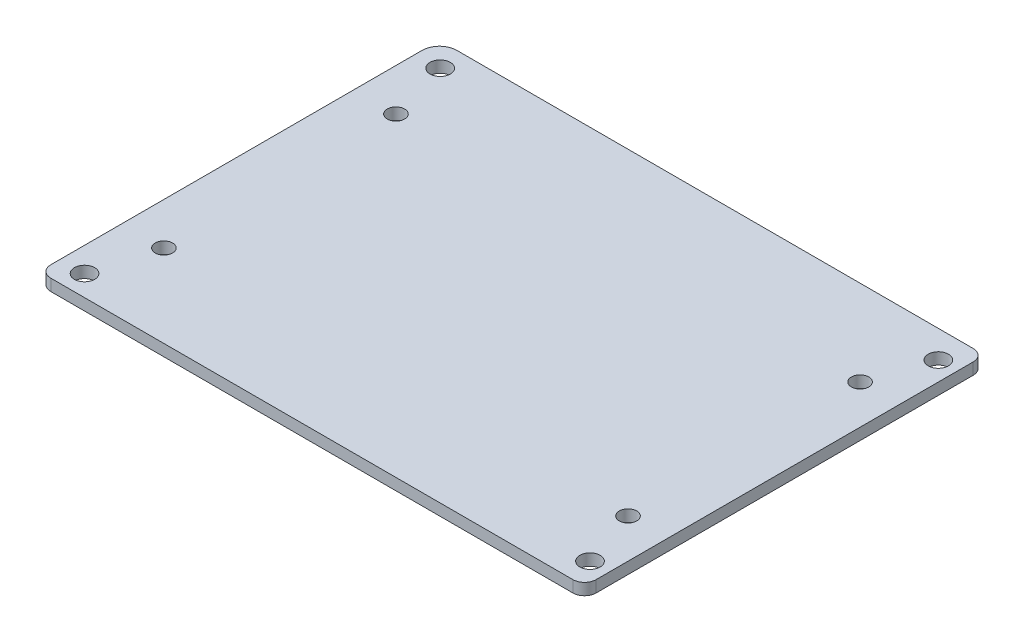
ISO-10303-21;
HEADER;
FILE_DESCRIPTION(('STEP AP214'),'2;1');
FILE_NAME('part.step','',(''),(''),'','','');
FILE_SCHEMA(('AUTOMOTIVE_DESIGN { 1 0 10303 214 1 1 1 1 }'));
ENDSEC;
DATA;
#1=APPLICATION_CONTEXT('core data for automotive mechanical design processes');
#2=APPLICATION_PROTOCOL_DEFINITION('international standard','automotive_design',2000,#1);
#3=PRODUCT_CONTEXT('',#1,'mechanical');
#4=PRODUCT('Part','Part','',(#3));
#5=PRODUCT_RELATED_PRODUCT_CATEGORY('part','',(#4));
#6=PRODUCT_DEFINITION_FORMATION('','',#4);
#7=PRODUCT_DEFINITION_CONTEXT('part definition',#1,'design');
#8=PRODUCT_DEFINITION('design','',#6,#7);
#9=PRODUCT_DEFINITION_SHAPE('','',#8);
#10=(LENGTH_UNIT() NAMED_UNIT(*) SI_UNIT(.MILLI.,.METRE.));
#11=(NAMED_UNIT(*) PLANE_ANGLE_UNIT() SI_UNIT($,.RADIAN.));
#12=(NAMED_UNIT(*) SI_UNIT($,.STERADIAN.) SOLID_ANGLE_UNIT());
#13=UNCERTAINTY_MEASURE_WITH_UNIT(LENGTH_MEASURE(1.E-05),#10,'distance_accuracy_value','');
#14=(GEOMETRIC_REPRESENTATION_CONTEXT(3) GLOBAL_UNCERTAINTY_ASSIGNED_CONTEXT((#13)) GLOBAL_UNIT_ASSIGNED_CONTEXT((#10,
#11,#12)) REPRESENTATION_CONTEXT('',''));
#15=CARTESIAN_POINT('',(0.,0.,0.));
#16=DIRECTION('',(0.,0.,1.));
#17=DIRECTION('',(1.,0.,0.));
#18=AXIS2_PLACEMENT_3D('',#15,#16,#17);
#19=CARTESIAN_POINT('',(44.7518020275219,2.,-32.7486797980187));
#20=DIRECTION('',(0.,-1.,0.));
#21=DIRECTION('',(0.,0.,-1.));
#22=AXIS2_PLACEMENT_3D('',#19,#20,#21);
#23=PLANE('',#22);
#24=CARTESIAN_POINT('',(40.0000000000001,2.,20.));
#25=DIRECTION('',(0.,1.,0.));
#26=DIRECTION('',(0.,0.,1.));
#27=AXIS2_PLACEMENT_3D('',#24,#25,#26);
#28=CIRCLE('',#27,1.5);
#29=CARTESIAN_POINT('',(40.0000000000001,2.,21.5));
#30=VERTEX_POINT('',#29);
#31=EDGE_CURVE('E170',#30,#30,#28,.T.);
#32=ORIENTED_EDGE('',*,*,#31,.F.);
#33=EDGE_LOOP('',(#32));
#34=FACE_BOUND('',#33,.T.);
#35=CARTESIAN_POINT('',(40.,2.,-20.));
#36=DIRECTION('',(0.,1.,0.));
#37=DIRECTION('',(0.,0.,1.));
#38=AXIS2_PLACEMENT_3D('',#35,#36,#37);
#39=CIRCLE('',#38,1.5);
#40=CARTESIAN_POINT('',(40.,2.,-18.5));
#41=VERTEX_POINT('',#40);
#42=EDGE_CURVE('E281',#41,#41,#39,.T.);
#43=ORIENTED_EDGE('',*,*,#42,.F.);
#44=EDGE_LOOP('',(#43));
#45=FACE_BOUND('',#44,.T.);
#46=CARTESIAN_POINT('',(-40.0000000000001,2.,-20.));
#47=DIRECTION('',(0.,1.,0.));
#48=DIRECTION('',(0.,0.,1.));
#49=AXIS2_PLACEMENT_3D('',#46,#47,#48);
#50=CIRCLE('',#49,1.5);
#51=CARTESIAN_POINT('',(-40.0000000000001,2.,-18.5));
#52=VERTEX_POINT('',#51);
#53=EDGE_CURVE('E183',#52,#52,#50,.T.);
#54=ORIENTED_EDGE('',*,*,#53,.F.);
#55=EDGE_LOOP('',(#54));
#56=FACE_BOUND('',#55,.T.);
#57=CARTESIAN_POINT('',(-40.,2.,20.));
#58=DIRECTION('',(0.,1.,0.));
#59=DIRECTION('',(0.,0.,1.));
#60=AXIS2_PLACEMENT_3D('',#57,#58,#59);
#61=CIRCLE('',#60,1.5);
#62=CARTESIAN_POINT('',(-40.,2.,21.5));
#63=VERTEX_POINT('',#62);
#64=EDGE_CURVE('E166',#63,#63,#61,.T.);
#65=ORIENTED_EDGE('',*,*,#64,.F.);
#66=EDGE_LOOP('',(#65));
#67=FACE_BOUND('',#66,.T.);
#68=CARTESIAN_POINT('',(44.7518020275219,2.,-32.7486797980187));
#69=DIRECTION('',(0.,1.,0.));
#70=DIRECTION('',(0.,0.,-1.));
#71=AXIS2_PLACEMENT_3D('',#68,#69,#70);
#72=CIRCLE('',#71,2.);
#73=CARTESIAN_POINT('',(46.7518020275218,2.,-32.7486797980187));
#74=VERTEX_POINT('',#73);
#75=CARTESIAN_POINT('',(44.7518020275219,2.,-34.7486797980188));
#76=VERTEX_POINT('',#75);
#77=EDGE_CURVE('E150',#74,#76,#72,.T.);
#78=ORIENTED_EDGE('',*,*,#77,.T.);
#79=DIRECTION('',(-1.,0.,0.));
#80=VECTOR('',#79,1.);
#81=CARTESIAN_POINT('',(-44.2481979724781,2.,-34.7486797980187));
#82=LINE('',#81,#80);
#83=CARTESIAN_POINT('',(-44.2481979724781,2.,-34.7486797980187));
#84=VERTEX_POINT('',#83);
#85=EDGE_CURVE('E98',#76,#84,#82,.T.);
#86=ORIENTED_EDGE('',*,*,#85,.T.);
#87=CARTESIAN_POINT('',(-44.2481979724781,2.,-31.7486797980187));
#88=DIRECTION('',(0.,1.,0.));
#89=DIRECTION('',(0.,0.,1.));
#90=AXIS2_PLACEMENT_3D('',#87,#88,#89);
#91=CIRCLE('',#90,3.00000000000001);
#92=CARTESIAN_POINT('',(-47.2481979724782,2.,-31.7486797980187));
#93=VERTEX_POINT('',#92);
#94=EDGE_CURVE('E209',#84,#93,#91,.T.);
#95=ORIENTED_EDGE('',*,*,#94,.T.);
#96=DIRECTION('',(0.,0.,1.));
#97=VECTOR('',#96,1.);
#98=CARTESIAN_POINT('',(-47.2481979724782,2.,-31.7486797980187));
#99=LINE('',#98,#97);
#100=CARTESIAN_POINT('',(-47.2481979724781,2.,32.2513202019813));
#101=VERTEX_POINT('',#100);
#102=EDGE_CURVE('E211',#93,#101,#99,.T.);
#103=ORIENTED_EDGE('',*,*,#102,.T.);
#104=CARTESIAN_POINT('',(-45.2481979724781,2.,32.2513202019813));
#105=DIRECTION('',(0.,1.,0.));
#106=DIRECTION('',(0.,0.,1.));
#107=AXIS2_PLACEMENT_3D('',#104,#105,#106);
#108=CIRCLE('',#107,2.);
#109=CARTESIAN_POINT('',(-45.2481979724781,2.,34.2513202019813));
#110=VERTEX_POINT('',#109);
#111=EDGE_CURVE('E117',#101,#110,#108,.T.);
#112=ORIENTED_EDGE('',*,*,#111,.T.);
#113=DIRECTION('',(1.,0.,0.));
#114=VECTOR('',#113,1.);
#115=CARTESIAN_POINT('',(-45.2481979724781,2.,34.2513202019813));
#116=LINE('',#115,#114);
#117=CARTESIAN_POINT('',(44.7518020275219,2.,34.2513202019813));
#118=VERTEX_POINT('',#117);
#119=EDGE_CURVE('E111',#110,#118,#116,.T.);
#120=ORIENTED_EDGE('',*,*,#119,.T.);
#121=CARTESIAN_POINT('',(44.7518020275219,2.,32.2513202019813));
#122=DIRECTION('',(0.,1.,0.));
#123=DIRECTION('',(0.,0.,1.));
#124=AXIS2_PLACEMENT_3D('',#121,#122,#123);
#125=CIRCLE('',#124,2.);
#126=CARTESIAN_POINT('',(46.7518020275219,2.,32.2513202019813));
#127=VERTEX_POINT('',#126);
#128=EDGE_CURVE('E115',#118,#127,#125,.T.);
#129=ORIENTED_EDGE('',*,*,#128,.T.);
#130=DIRECTION('',(0.,0.,-1.));
#131=VECTOR('',#130,1.);
#132=CARTESIAN_POINT('',(46.7518020275218,2.,-32.7486797980187));
#133=LINE('',#132,#131);
#134=EDGE_CURVE('E55',#127,#74,#133,.T.);
#135=ORIENTED_EDGE('',*,*,#134,.T.);
#136=EDGE_LOOP('',(#78,#86,#95,#103,#112,#120,#129,#135));
#137=FACE_BOUND('',#136,.T.);
#138=CARTESIAN_POINT('',(-43.0290340640688,2.,-30.65));
#139=DIRECTION('',(0.,1.,0.));
#140=DIRECTION('',(0.,0.,1.));
#141=AXIS2_PLACEMENT_3D('',#138,#139,#140);
#142=CIRCLE('',#141,1.75);
#143=CARTESIAN_POINT('',(-43.0290340640688,2.,-28.9));
#144=VERTEX_POINT('',#143);
#145=EDGE_CURVE('E139',#144,#144,#142,.T.);
#146=ORIENTED_EDGE('',*,*,#145,.F.);
#147=EDGE_LOOP('',(#146));
#148=FACE_BOUND('',#147,.T.);
#149=CARTESIAN_POINT('',(43.4686949688664,2.,-30.0232048620802));
#150=DIRECTION('',(0.,1.,0.));
#151=DIRECTION('',(0.,0.,-1.));
#152=AXIS2_PLACEMENT_3D('',#149,#150,#151);
#153=CIRCLE('',#152,1.75000000000002);
#154=CARTESIAN_POINT('',(43.4686949688664,2.,-31.7732048620802));
#155=VERTEX_POINT('',#154);
#156=EDGE_CURVE('E197',#155,#155,#153,.T.);
#157=ORIENTED_EDGE('',*,*,#156,.F.);
#158=EDGE_LOOP('',(#157));
#159=FACE_BOUND('',#158,.T.);
#160=CARTESIAN_POINT('',(43.4686949688664,2.,30.0232048620802));
#161=DIRECTION('',(0.,1.,0.));
#162=DIRECTION('',(0.,0.,1.));
#163=AXIS2_PLACEMENT_3D('',#160,#161,#162);
#164=CIRCLE('',#163,1.75000000000002);
#165=CARTESIAN_POINT('',(43.4686949688664,2.,31.7732048620802));
#166=VERTEX_POINT('',#165);
#167=EDGE_CURVE('E191',#166,#166,#164,.T.);
#168=ORIENTED_EDGE('',*,*,#167,.F.);
#169=EDGE_LOOP('',(#168));
#170=FACE_BOUND('',#169,.T.);
#171=CARTESIAN_POINT('',(-43.0290340640688,2.,30.65));
#172=DIRECTION('',(0.,1.,0.));
#173=DIRECTION('',(0.,0.,-1.));
#174=AXIS2_PLACEMENT_3D('',#171,#172,#173);
#175=CIRCLE('',#174,1.75);
#176=CARTESIAN_POINT('',(-43.0290340640688,2.,28.9));
#177=VERTEX_POINT('',#176);
#178=EDGE_CURVE('E185',#177,#177,#175,.T.);
#179=ORIENTED_EDGE('',*,*,#178,.F.);
#180=EDGE_LOOP('',(#179));
#181=FACE_BOUND('',#180,.T.);
#182=ADVANCED_FACE('F36',(#34,#45,#56,#67,#137,#148,#159,#170,#181),#23,.F.);
#183=CARTESIAN_POINT('',(44.7518020275219,0.,-32.7486797980187));
#184=DIRECTION('',(0.,-1.,0.));
#185=DIRECTION('',(0.,0.,-1.));
#186=AXIS2_PLACEMENT_3D('',#183,#184,#185);
#187=PLANE('',#186);
#188=CARTESIAN_POINT('',(40.0000000000001,0.,20.));
#189=DIRECTION('',(0.,-1.,0.));
#190=DIRECTION('',(0.,0.,-1.));
#191=AXIS2_PLACEMENT_3D('',#188,#189,#190);
#192=CIRCLE('',#191,1.5);
#193=CARTESIAN_POINT('',(40.0000000000001,0.,18.5));
#194=VERTEX_POINT('',#193);
#195=EDGE_CURVE('E40',#194,#194,#192,.T.);
#196=ORIENTED_EDGE('',*,*,#195,.F.);
#197=EDGE_LOOP('',(#196));
#198=FACE_BOUND('',#197,.T.);
#199=CARTESIAN_POINT('',(40.,0.,-20.));
#200=DIRECTION('',(0.,-1.,0.));
#201=DIRECTION('',(0.,0.,-1.));
#202=AXIS2_PLACEMENT_3D('',#199,#200,#201);
#203=CIRCLE('',#202,1.5);
#204=CARTESIAN_POINT('',(40.,0.,-21.5));
#205=VERTEX_POINT('',#204);
#206=EDGE_CURVE('E169',#205,#205,#203,.T.);
#207=ORIENTED_EDGE('',*,*,#206,.F.);
#208=EDGE_LOOP('',(#207));
#209=FACE_BOUND('',#208,.T.);
#210=CARTESIAN_POINT('',(-40.0000000000001,0.,-20.));
#211=DIRECTION('',(0.,-1.,0.));
#212=DIRECTION('',(0.,0.,-1.));
#213=AXIS2_PLACEMENT_3D('',#210,#211,#212);
#214=CIRCLE('',#213,1.5);
#215=CARTESIAN_POINT('',(-40.0000000000001,0.,-21.5));
#216=VERTEX_POINT('',#215);
#217=EDGE_CURVE('E167',#216,#216,#214,.T.);
#218=ORIENTED_EDGE('',*,*,#217,.F.);
#219=EDGE_LOOP('',(#218));
#220=FACE_BOUND('',#219,.T.);
#221=CARTESIAN_POINT('',(-40.,0.,20.));
#222=DIRECTION('',(0.,-1.,0.));
#223=DIRECTION('',(0.,0.,-1.));
#224=AXIS2_PLACEMENT_3D('',#221,#222,#223);
#225=CIRCLE('',#224,1.5);
#226=CARTESIAN_POINT('',(-40.,0.,18.5));
#227=VERTEX_POINT('',#226);
#228=EDGE_CURVE('E162',#227,#227,#225,.T.);
#229=ORIENTED_EDGE('',*,*,#228,.F.);
#230=EDGE_LOOP('',(#229));
#231=FACE_BOUND('',#230,.T.);
#232=CARTESIAN_POINT('',(43.4686949688664,0.,30.0232048620802));
#233=DIRECTION('',(0.,1.,0.));
#234=DIRECTION('',(0.,0.,1.));
#235=AXIS2_PLACEMENT_3D('',#232,#233,#234);
#236=CIRCLE('',#235,1.75000000000002);
#237=CARTESIAN_POINT('',(43.4686949688664,0.,31.7732048620802));
#238=VERTEX_POINT('',#237);
#239=EDGE_CURVE('E188',#238,#238,#236,.T.);
#240=ORIENTED_EDGE('',*,*,#239,.T.);
#241=EDGE_LOOP('',(#240));
#242=FACE_BOUND('',#241,.T.);
#243=CARTESIAN_POINT('',(-43.0290340640688,0.,-30.65));
#244=DIRECTION('',(0.,1.,0.));
#245=DIRECTION('',(0.,0.,1.));
#246=AXIS2_PLACEMENT_3D('',#243,#244,#245);
#247=CIRCLE('',#246,1.75);
#248=CARTESIAN_POINT('',(-43.0290340640688,0.,-28.9));
#249=VERTEX_POINT('',#248);
#250=EDGE_CURVE('E200',#249,#249,#247,.T.);
#251=ORIENTED_EDGE('',*,*,#250,.T.);
#252=EDGE_LOOP('',(#251));
#253=FACE_BOUND('',#252,.T.);
#254=CARTESIAN_POINT('',(44.7518020275219,0.,-32.7486797980187));
#255=DIRECTION('',(0.,1.,0.));
#256=DIRECTION('',(0.,0.,-1.));
#257=AXIS2_PLACEMENT_3D('',#254,#255,#256);
#258=CIRCLE('',#257,2.);
#259=CARTESIAN_POINT('',(46.7518020275218,0.,-32.7486797980187));
#260=VERTEX_POINT('',#259);
#261=CARTESIAN_POINT('',(44.7518020275219,0.,-34.7486797980188));
#262=VERTEX_POINT('',#261);
#263=EDGE_CURVE('E135',#260,#262,#258,.T.);
#264=ORIENTED_EDGE('',*,*,#263,.F.);
#265=DIRECTION('',(0.,0.,-1.));
#266=VECTOR('',#265,1.);
#267=CARTESIAN_POINT('',(46.7518020275218,0.,-32.7486797980187));
#268=LINE('',#267,#266);
#269=CARTESIAN_POINT('',(46.7518020275219,0.,32.2513202019813));
#270=VERTEX_POINT('',#269);
#271=EDGE_CURVE('E90',#270,#260,#268,.T.);
#272=ORIENTED_EDGE('',*,*,#271,.F.);
#273=CARTESIAN_POINT('',(44.7518020275219,0.,32.2513202019813));
#274=DIRECTION('',(0.,1.,0.));
#275=DIRECTION('',(0.,0.,1.));
#276=AXIS2_PLACEMENT_3D('',#273,#274,#275);
#277=CIRCLE('',#276,2.);
#278=CARTESIAN_POINT('',(44.7518020275219,0.,34.2513202019813));
#279=VERTEX_POINT('',#278);
#280=EDGE_CURVE('E84',#279,#270,#277,.T.);
#281=ORIENTED_EDGE('',*,*,#280,.F.);
#282=DIRECTION('',(1.,0.,0.));
#283=VECTOR('',#282,1.);
#284=CARTESIAN_POINT('',(-45.2481979724781,0.,34.2513202019813));
#285=LINE('',#284,#283);
#286=CARTESIAN_POINT('',(-45.2481979724781,0.,34.2513202019813));
#287=VERTEX_POINT('',#286);
#288=EDGE_CURVE('E125',#287,#279,#285,.T.);
#289=ORIENTED_EDGE('',*,*,#288,.F.);
#290=CARTESIAN_POINT('',(-45.2481979724781,0.,32.2513202019813));
#291=DIRECTION('',(0.,1.,0.));
#292=DIRECTION('',(0.,0.,1.));
#293=AXIS2_PLACEMENT_3D('',#290,#291,#292);
#294=CIRCLE('',#293,2.);
#295=CARTESIAN_POINT('',(-47.2481979724781,0.,32.2513202019813));
#296=VERTEX_POINT('',#295);
#297=EDGE_CURVE('E145',#296,#287,#294,.T.);
#298=ORIENTED_EDGE('',*,*,#297,.F.);
#299=DIRECTION('',(0.,0.,1.));
#300=VECTOR('',#299,1.);
#301=CARTESIAN_POINT('',(-47.2481979724782,0.,-31.7486797980187));
#302=LINE('',#301,#300);
#303=CARTESIAN_POINT('',(-47.2481979724782,0.,-31.7486797980187));
#304=VERTEX_POINT('',#303);
#305=EDGE_CURVE('E143',#304,#296,#302,.T.);
#306=ORIENTED_EDGE('',*,*,#305,.F.);
#307=CARTESIAN_POINT('',(-44.2481979724781,0.,-31.7486797980187));
#308=DIRECTION('',(0.,1.,0.));
#309=DIRECTION('',(0.,0.,1.));
#310=AXIS2_PLACEMENT_3D('',#307,#308,#309);
#311=CIRCLE('',#310,3.00000000000001);
#312=CARTESIAN_POINT('',(-44.2481979724781,0.,-34.7486797980187));
#313=VERTEX_POINT('',#312);
#314=EDGE_CURVE('E141',#313,#304,#311,.T.);
#315=ORIENTED_EDGE('',*,*,#314,.F.);
#316=DIRECTION('',(-1.,0.,0.));
#317=VECTOR('',#316,1.);
#318=CARTESIAN_POINT('',(-44.2481979724781,0.,-34.7486797980187));
#319=LINE('',#318,#317);
#320=EDGE_CURVE('E138',#262,#313,#319,.T.);
#321=ORIENTED_EDGE('',*,*,#320,.F.);
#322=EDGE_LOOP('',(#264,#272,#281,#289,#298,#306,#315,#321));
#323=FACE_BOUND('',#322,.T.);
#324=CARTESIAN_POINT('',(43.4686949688664,0.,-30.0232048620802));
#325=DIRECTION('',(0.,1.,0.));
#326=DIRECTION('',(0.,0.,-1.));
#327=AXIS2_PLACEMENT_3D('',#324,#325,#326);
#328=CIRCLE('',#327,1.75000000000002);
#329=CARTESIAN_POINT('',(43.4686949688664,0.,-31.7732048620802));
#330=VERTEX_POINT('',#329);
#331=EDGE_CURVE('E194',#330,#330,#328,.T.);
#332=ORIENTED_EDGE('',*,*,#331,.T.);
#333=EDGE_LOOP('',(#332));
#334=FACE_BOUND('',#333,.T.);
#335=CARTESIAN_POINT('',(-43.0290340640688,0.,30.65));
#336=DIRECTION('',(0.,1.,0.));
#337=DIRECTION('',(0.,0.,-1.));
#338=AXIS2_PLACEMENT_3D('',#335,#336,#337);
#339=CIRCLE('',#338,1.75);
#340=CARTESIAN_POINT('',(-43.0290340640688,0.,28.9));
#341=VERTEX_POINT('',#340);
#342=EDGE_CURVE('E165',#341,#341,#339,.T.);
#343=ORIENTED_EDGE('',*,*,#342,.T.);
#344=EDGE_LOOP('',(#343));
#345=FACE_BOUND('',#344,.T.);
#346=ADVANCED_FACE('F224',(#198,#209,#220,#231,#242,#253,#323,#334,#345),#187,.T.);
#347=CARTESIAN_POINT('',(44.7518020275219,2.,-32.7486797980187));
#348=DIRECTION('',(0.,-1.,0.));
#349=DIRECTION('',(0.,0.,-1.));
#350=AXIS2_PLACEMENT_3D('',#347,#348,#349);
#351=CYLINDRICAL_SURFACE('',#350,2.);
#352=ORIENTED_EDGE('',*,*,#263,.T.);
#353=DIRECTION('',(0.,-1.,0.));
#354=VECTOR('',#353,1.);
#355=CARTESIAN_POINT('',(44.7518020275219,2.,-34.7486797980188));
#356=LINE('',#355,#354);
#357=EDGE_CURVE('E11',#76,#262,#356,.T.);
#358=ORIENTED_EDGE('',*,*,#357,.F.);
#359=ORIENTED_EDGE('',*,*,#77,.F.);
#360=DIRECTION('',(0.,-1.,0.));
#361=VECTOR('',#360,1.);
#362=CARTESIAN_POINT('',(46.7518020275218,2.,-32.7486797980187));
#363=LINE('',#362,#361);
#364=EDGE_CURVE('E131',#74,#260,#363,.T.);
#365=ORIENTED_EDGE('',*,*,#364,.T.);
#366=EDGE_LOOP('',(#352,#358,#359,#365));
#367=FACE_BOUND('',#366,.T.);
#368=ADVANCED_FACE('F38',(#367),#351,.T.);
#369=CARTESIAN_POINT('',(-44.2481979724781,2.,-34.7486797980187));
#370=DIRECTION('',(0.,0.,1.));
#371=DIRECTION('',(1.,0.,0.));
#372=AXIS2_PLACEMENT_3D('',#369,#370,#371);
#373=PLANE('',#372);
#374=ORIENTED_EDGE('',*,*,#320,.T.);
#375=DIRECTION('',(0.,-1.,0.));
#376=VECTOR('',#375,1.);
#377=CARTESIAN_POINT('',(-44.2481979724781,2.,-34.7486797980187));
#378=LINE('',#377,#376);
#379=EDGE_CURVE('E46',#84,#313,#378,.T.);
#380=ORIENTED_EDGE('',*,*,#379,.F.);
#381=ORIENTED_EDGE('',*,*,#85,.F.);
#382=ORIENTED_EDGE('',*,*,#357,.T.);
#383=EDGE_LOOP('',(#374,#380,#381,#382));
#384=FACE_BOUND('',#383,.T.);
#385=ADVANCED_FACE('F364',(#384),#373,.F.);
#386=CARTESIAN_POINT('',(-44.2481979724781,2.,-31.7486797980187));
#387=DIRECTION('',(0.,-1.,0.));
#388=DIRECTION('',(0.,0.,-1.));
#389=AXIS2_PLACEMENT_3D('',#386,#387,#388);
#390=CYLINDRICAL_SURFACE('',#389,3.00000000000001);
#391=ORIENTED_EDGE('',*,*,#314,.T.);
#392=DIRECTION('',(0.,-1.,0.));
#393=VECTOR('',#392,1.);
#394=CARTESIAN_POINT('',(-47.2481979724782,2.,-31.7486797980187));
#395=LINE('',#394,#393);
#396=EDGE_CURVE('E157',#93,#304,#395,.T.);
#397=ORIENTED_EDGE('',*,*,#396,.F.);
#398=ORIENTED_EDGE('',*,*,#94,.F.);
#399=ORIENTED_EDGE('',*,*,#379,.T.);
#400=EDGE_LOOP('',(#391,#397,#398,#399));
#401=FACE_BOUND('',#400,.T.);
#402=ADVANCED_FACE('F355',(#401),#390,.T.);
#403=CARTESIAN_POINT('',(-47.2481979724782,2.,-31.7486797980187));
#404=DIRECTION('',(1.,0.,0.));
#405=DIRECTION('',(0.,0.,-1.));
#406=AXIS2_PLACEMENT_3D('',#403,#404,#405);
#407=PLANE('',#406);
#408=ORIENTED_EDGE('',*,*,#305,.T.);
#409=DIRECTION('',(0.,-1.,0.));
#410=VECTOR('',#409,1.);
#411=CARTESIAN_POINT('',(-47.2481979724781,2.,32.2513202019813));
#412=LINE('',#411,#410);
#413=EDGE_CURVE('E154',#101,#296,#412,.T.);
#414=ORIENTED_EDGE('',*,*,#413,.F.);
#415=ORIENTED_EDGE('',*,*,#102,.F.);
#416=ORIENTED_EDGE('',*,*,#396,.T.);
#417=EDGE_LOOP('',(#408,#414,#415,#416));
#418=FACE_BOUND('',#417,.T.);
#419=ADVANCED_FACE('F217',(#418),#407,.F.);
#420=CARTESIAN_POINT('',(-45.2481979724781,2.,32.2513202019813));
#421=DIRECTION('',(0.,-1.,0.));
#422=DIRECTION('',(0.,0.,-1.));
#423=AXIS2_PLACEMENT_3D('',#420,#421,#422);
#424=CYLINDRICAL_SURFACE('',#423,2.);
#425=ORIENTED_EDGE('',*,*,#297,.T.);
#426=DIRECTION('',(0.,-1.,0.));
#427=VECTOR('',#426,1.);
#428=CARTESIAN_POINT('',(-45.2481979724781,2.,34.2513202019813));
#429=LINE('',#428,#427);
#430=EDGE_CURVE('E126',#110,#287,#429,.T.);
#431=ORIENTED_EDGE('',*,*,#430,.F.);
#432=ORIENTED_EDGE('',*,*,#111,.F.);
#433=ORIENTED_EDGE('',*,*,#413,.T.);
#434=EDGE_LOOP('',(#425,#431,#432,#433));
#435=FACE_BOUND('',#434,.T.);
#436=ADVANCED_FACE('F221',(#435),#424,.T.);
#437=CARTESIAN_POINT('',(-45.2481979724781,2.,34.2513202019813));
#438=DIRECTION('',(0.,0.,-1.));
#439=DIRECTION('',(-1.,0.,0.));
#440=AXIS2_PLACEMENT_3D('',#437,#438,#439);
#441=PLANE('',#440);
#442=ORIENTED_EDGE('',*,*,#288,.T.);
#443=DIRECTION('',(0.,-1.,0.));
#444=VECTOR('',#443,1.);
#445=CARTESIAN_POINT('',(44.7518020275219,2.,34.2513202019813));
#446=LINE('',#445,#444);
#447=EDGE_CURVE('E122',#118,#279,#446,.T.);
#448=ORIENTED_EDGE('',*,*,#447,.F.);
#449=ORIENTED_EDGE('',*,*,#119,.F.);
#450=ORIENTED_EDGE('',*,*,#430,.T.);
#451=EDGE_LOOP('',(#442,#448,#449,#450));
#452=FACE_BOUND('',#451,.T.);
#453=ADVANCED_FACE('F123',(#452),#441,.F.);
#454=CARTESIAN_POINT('',(44.7518020275219,2.,32.2513202019813));
#455=DIRECTION('',(0.,-1.,0.));
#456=DIRECTION('',(0.,0.,-1.));
#457=AXIS2_PLACEMENT_3D('',#454,#455,#456);
#458=CYLINDRICAL_SURFACE('',#457,2.);
#459=ORIENTED_EDGE('',*,*,#280,.T.);
#460=DIRECTION('',(0.,-1.,0.));
#461=VECTOR('',#460,1.);
#462=CARTESIAN_POINT('',(46.7518020275219,2.,32.2513202019813));
#463=LINE('',#462,#461);
#464=EDGE_CURVE('E127',#127,#270,#463,.T.);
#465=ORIENTED_EDGE('',*,*,#464,.F.);
#466=ORIENTED_EDGE('',*,*,#128,.F.);
#467=ORIENTED_EDGE('',*,*,#447,.T.);
#468=EDGE_LOOP('',(#459,#465,#466,#467));
#469=FACE_BOUND('',#468,.T.);
#470=ADVANCED_FACE('F129',(#469),#458,.T.);
#471=CARTESIAN_POINT('',(46.7518020275218,2.,-32.7486797980187));
#472=DIRECTION('',(-1.,0.,0.));
#473=DIRECTION('',(0.,0.,1.));
#474=AXIS2_PLACEMENT_3D('',#471,#472,#473);
#475=PLANE('',#474);
#476=ORIENTED_EDGE('',*,*,#271,.T.);
#477=ORIENTED_EDGE('',*,*,#364,.F.);
#478=ORIENTED_EDGE('',*,*,#134,.F.);
#479=ORIENTED_EDGE('',*,*,#464,.T.);
#480=EDGE_LOOP('',(#476,#477,#478,#479));
#481=FACE_BOUND('',#480,.T.);
#482=ADVANCED_FACE('F230',(#481),#475,.F.);
#483=CARTESIAN_POINT('',(-43.0290340640688,2.,-30.65));
#484=DIRECTION('',(0.,-1.,0.));
#485=DIRECTION('',(0.,0.,-1.));
#486=AXIS2_PLACEMENT_3D('',#483,#484,#485);
#487=CYLINDRICAL_SURFACE('',#486,1.75);
#488=ORIENTED_EDGE('',*,*,#145,.T.);
#489=EDGE_LOOP('',(#488));
#490=FACE_BOUND('',#489,.T.);
#491=ORIENTED_EDGE('',*,*,#250,.F.);
#492=EDGE_LOOP('',(#491));
#493=FACE_BOUND('',#492,.T.);
#494=ADVANCED_FACE('F232',(#490,#493),#487,.F.);
#495=CARTESIAN_POINT('',(43.4686949688664,2.,-30.0232048620802));
#496=DIRECTION('',(0.,-1.,0.));
#497=DIRECTION('',(0.,0.,-1.));
#498=AXIS2_PLACEMENT_3D('',#495,#496,#497);
#499=CYLINDRICAL_SURFACE('',#498,1.75000000000002);
#500=ORIENTED_EDGE('',*,*,#156,.T.);
#501=EDGE_LOOP('',(#500));
#502=FACE_BOUND('',#501,.T.);
#503=ORIENTED_EDGE('',*,*,#331,.F.);
#504=EDGE_LOOP('',(#503));
#505=FACE_BOUND('',#504,.T.);
#506=ADVANCED_FACE('F238',(#502,#505),#499,.F.);
#507=CARTESIAN_POINT('',(43.4686949688664,2.,30.0232048620802));
#508=DIRECTION('',(0.,-1.,0.));
#509=DIRECTION('',(0.,0.,-1.));
#510=AXIS2_PLACEMENT_3D('',#507,#508,#509);
#511=CYLINDRICAL_SURFACE('',#510,1.75000000000002);
#512=ORIENTED_EDGE('',*,*,#167,.T.);
#513=EDGE_LOOP('',(#512));
#514=FACE_BOUND('',#513,.T.);
#515=ORIENTED_EDGE('',*,*,#239,.F.);
#516=EDGE_LOOP('',(#515));
#517=FACE_BOUND('',#516,.T.);
#518=ADVANCED_FACE('F255',(#514,#517),#511,.F.);
#519=CARTESIAN_POINT('',(-43.0290340640688,2.,30.65));
#520=DIRECTION('',(0.,-1.,0.));
#521=DIRECTION('',(0.,0.,-1.));
#522=AXIS2_PLACEMENT_3D('',#519,#520,#521);
#523=CYLINDRICAL_SURFACE('',#522,1.75);
#524=ORIENTED_EDGE('',*,*,#178,.T.);
#525=EDGE_LOOP('',(#524));
#526=FACE_BOUND('',#525,.T.);
#527=ORIENTED_EDGE('',*,*,#342,.F.);
#528=EDGE_LOOP('',(#527));
#529=FACE_BOUND('',#528,.T.);
#530=ADVANCED_FACE('F259',(#526,#529),#523,.F.);
#531=CARTESIAN_POINT('',(-40.,-8.,20.));
#532=DIRECTION('',(0.,1.,0.));
#533=DIRECTION('',(0.,0.,1.));
#534=AXIS2_PLACEMENT_3D('',#531,#532,#533);
#535=CYLINDRICAL_SURFACE('',#534,1.5);
#536=ORIENTED_EDGE('',*,*,#228,.T.);
#537=EDGE_LOOP('',(#536));
#538=FACE_BOUND('',#537,.T.);
#539=ORIENTED_EDGE('',*,*,#64,.T.);
#540=EDGE_LOOP('',(#539));
#541=FACE_BOUND('',#540,.T.);
#542=ADVANCED_FACE('F263',(#538,#541),#535,.F.);
#543=CARTESIAN_POINT('',(-40.0000000000001,-8.,-20.));
#544=DIRECTION('',(0.,1.,0.));
#545=DIRECTION('',(0.,0.,1.));
#546=AXIS2_PLACEMENT_3D('',#543,#544,#545);
#547=CYLINDRICAL_SURFACE('',#546,1.5);
#548=ORIENTED_EDGE('',*,*,#217,.T.);
#549=EDGE_LOOP('',(#548));
#550=FACE_BOUND('',#549,.T.);
#551=ORIENTED_EDGE('',*,*,#53,.T.);
#552=EDGE_LOOP('',(#551));
#553=FACE_BOUND('',#552,.T.);
#554=ADVANCED_FACE('F267',(#550,#553),#547,.F.);
#555=CARTESIAN_POINT('',(40.,-8.,-20.));
#556=DIRECTION('',(0.,1.,0.));
#557=DIRECTION('',(0.,0.,1.));
#558=AXIS2_PLACEMENT_3D('',#555,#556,#557);
#559=CYLINDRICAL_SURFACE('',#558,1.5);
#560=ORIENTED_EDGE('',*,*,#206,.T.);
#561=EDGE_LOOP('',(#560));
#562=FACE_BOUND('',#561,.T.);
#563=ORIENTED_EDGE('',*,*,#42,.T.);
#564=EDGE_LOOP('',(#563));
#565=FACE_BOUND('',#564,.T.);
#566=ADVANCED_FACE('F271',(#562,#565),#559,.F.);
#567=CARTESIAN_POINT('',(40.0000000000001,-8.,20.));
#568=DIRECTION('',(0.,1.,0.));
#569=DIRECTION('',(0.,0.,1.));
#570=AXIS2_PLACEMENT_3D('',#567,#568,#569);
#571=CYLINDRICAL_SURFACE('',#570,1.5);
#572=ORIENTED_EDGE('',*,*,#195,.T.);
#573=EDGE_LOOP('',(#572));
#574=FACE_BOUND('',#573,.T.);
#575=ORIENTED_EDGE('',*,*,#31,.T.);
#576=EDGE_LOOP('',(#575));
#577=FACE_BOUND('',#576,.T.);
#578=ADVANCED_FACE('F275',(#574,#577),#571,.F.);
#579=CLOSED_SHELL('',(#182,#346,#368,#385,#402,#419,#436,#453,#470,#482,#494,#506,#518,#530,
#542,#554,#566,#578));
#580=MANIFOLD_SOLID_BREP('B2',#579);
#581=ADVANCED_BREP_SHAPE_REPRESENTATION('',(#18,#580),#14);
#582=SHAPE_DEFINITION_REPRESENTATION(#9,#581);
ENDSEC;
END-ISO-10303-21;
